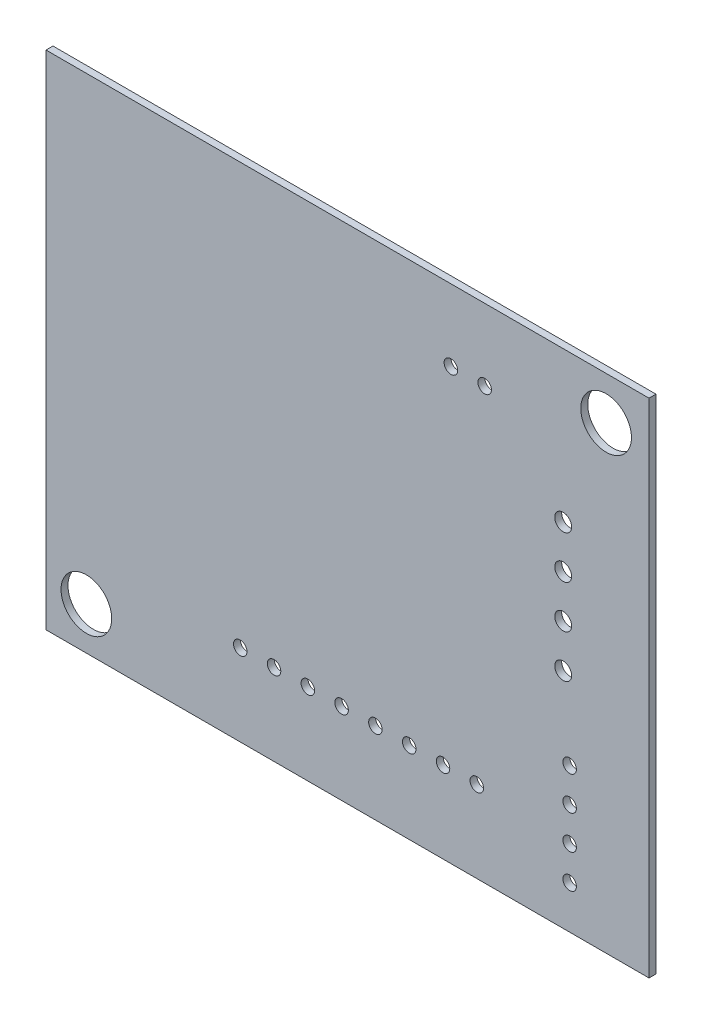
ISO-10303-21;
HEADER;
FILE_DESCRIPTION(('STEP AP214'),'2;1');
FILE_NAME('part.step','',(''),(''),'','','');
FILE_SCHEMA(('AUTOMOTIVE_DESIGN { 1 0 10303 214 1 1 1 1 }'));
ENDSEC;
DATA;
#1=APPLICATION_CONTEXT('core data for automotive mechanical design processes');
#2=APPLICATION_PROTOCOL_DEFINITION('international standard','automotive_design',2000,#1);
#3=PRODUCT_CONTEXT('',#1,'mechanical');
#4=PRODUCT('Part','Part','',(#3));
#5=PRODUCT_RELATED_PRODUCT_CATEGORY('part','',(#4));
#6=PRODUCT_DEFINITION_FORMATION('','',#4);
#7=PRODUCT_DEFINITION_CONTEXT('part definition',#1,'design');
#8=PRODUCT_DEFINITION('design','',#6,#7);
#9=PRODUCT_DEFINITION_SHAPE('','',#8);
#10=(LENGTH_UNIT() NAMED_UNIT(*) SI_UNIT(.MILLI.,.METRE.));
#11=(NAMED_UNIT(*) PLANE_ANGLE_UNIT() SI_UNIT($,.RADIAN.));
#12=(NAMED_UNIT(*) SI_UNIT($,.STERADIAN.) SOLID_ANGLE_UNIT());
#13=UNCERTAINTY_MEASURE_WITH_UNIT(LENGTH_MEASURE(1.E-05),#10,'distance_accuracy_value','');
#14=(GEOMETRIC_REPRESENTATION_CONTEXT(3) GLOBAL_UNCERTAINTY_ASSIGNED_CONTEXT((#13)) GLOBAL_UNIT_ASSIGNED_CONTEXT((#10,
#11,#12)) REPRESENTATION_CONTEXT('',''));
#15=CARTESIAN_POINT('',(0.,0.,0.));
#16=DIRECTION('',(0.,0.,1.));
#17=DIRECTION('',(1.,0.,0.));
#18=AXIS2_PLACEMENT_3D('',#15,#16,#17);
#19=CARTESIAN_POINT('',(67.564002990723,64.388999938965,0.41148));
#20=DIRECTION('',(0.,0.,-1.));
#21=DIRECTION('',(0.,-1.,0.));
#22=AXIS2_PLACEMENT_3D('',#19,#20,#21);
#23=PLANE('',#22);
#24=CARTESIAN_POINT('',(100.711,91.567,0.41148));
#25=DIRECTION('',(0.,0.,1.));
#26=DIRECTION('',(1.,0.,0.));
#27=AXIS2_PLACEMENT_3D('',#24,#25,#26);
#28=CIRCLE('',#27,1.5);
#29=CARTESIAN_POINT('',(102.211,91.567,0.41148));
#30=VERTEX_POINT('',#29);
#31=EDGE_CURVE('E26',#30,#30,#28,.T.);
#32=ORIENTED_EDGE('',*,*,#31,.F.);
#33=EDGE_LOOP('',(#32));
#34=FACE_BOUND('',#33,.T.);
#35=CARTESIAN_POINT('',(98.171,85.217,0.41148));
#36=DIRECTION('',(0.,0.,1.));
#37=DIRECTION('',(1.,0.,0.));
#38=AXIS2_PLACEMENT_3D('',#35,#36,#37);
#39=CIRCLE('',#38,0.5);
#40=CARTESIAN_POINT('',(98.671,85.217,0.41148));
#41=VERTEX_POINT('',#40);
#42=EDGE_CURVE('E298',#41,#41,#39,.T.);
#43=ORIENTED_EDGE('',*,*,#42,.F.);
#44=EDGE_LOOP('',(#43));
#45=FACE_BOUND('',#44,.T.);
#46=CARTESIAN_POINT('',(98.171,80.137,0.41148));
#47=DIRECTION('',(0.,0.,1.));
#48=DIRECTION('',(1.,0.,0.));
#49=AXIS2_PLACEMENT_3D('',#46,#47,#48);
#50=CIRCLE('',#49,0.5);
#51=CARTESIAN_POINT('',(98.671,80.137,0.41148));
#52=VERTEX_POINT('',#51);
#53=EDGE_CURVE('E320',#52,#52,#50,.T.);
#54=ORIENTED_EDGE('',*,*,#53,.F.);
#55=EDGE_LOOP('',(#54));
#56=FACE_BOUND('',#55,.T.);
#57=CARTESIAN_POINT('',(93.524,89.864,0.41148));
#58=DIRECTION('',(0.,0.,1.));
#59=DIRECTION('',(1.,0.,0.));
#60=AXIS2_PLACEMENT_3D('',#57,#58,#59);
#61=CIRCLE('',#60,0.4);
#62=CARTESIAN_POINT('',(93.924,89.864,0.41148));
#63=VERTEX_POINT('',#62);
#64=EDGE_CURVE('E219',#63,#63,#61,.T.);
#65=ORIENTED_EDGE('',*,*,#64,.F.);
#66=EDGE_LOOP('',(#65));
#67=FACE_BOUND('',#66,.T.);
#68=CARTESIAN_POINT('',(98.171,82.677,0.41148));
#69=DIRECTION('',(0.,0.,1.));
#70=DIRECTION('',(1.,0.,0.));
#71=AXIS2_PLACEMENT_3D('',#68,#69,#70);
#72=CIRCLE('',#71,0.5);
#73=CARTESIAN_POINT('',(98.671,82.677,0.41148));
#74=VERTEX_POINT('',#73);
#75=EDGE_CURVE('E277',#74,#74,#72,.T.);
#76=ORIENTED_EDGE('',*,*,#75,.F.);
#77=EDGE_LOOP('',(#76));
#78=FACE_BOUND('',#77,.T.);
#79=CARTESIAN_POINT('',(98.552,68.922,0.41148));
#80=DIRECTION('',(0.,0.,1.));
#81=DIRECTION('',(1.,0.,0.));
#82=AXIS2_PLACEMENT_3D('',#79,#80,#81);
#83=CIRCLE('',#82,0.4);
#84=CARTESIAN_POINT('',(98.952,68.922,0.41148));
#85=VERTEX_POINT('',#84);
#86=EDGE_CURVE('E329',#85,#85,#83,.T.);
#87=ORIENTED_EDGE('',*,*,#86,.F.);
#88=EDGE_LOOP('',(#87));
#89=FACE_BOUND('',#88,.T.);
#90=CARTESIAN_POINT('',(98.552,70.922,0.41148));
#91=DIRECTION('',(0.,0.,1.));
#92=DIRECTION('',(1.,0.,0.));
#93=AXIS2_PLACEMENT_3D('',#90,#91,#92);
#94=CIRCLE('',#93,0.4);
#95=CARTESIAN_POINT('',(98.952,70.922,0.41148));
#96=VERTEX_POINT('',#95);
#97=EDGE_CURVE('E292',#96,#96,#94,.T.);
#98=ORIENTED_EDGE('',*,*,#97,.F.);
#99=EDGE_LOOP('',(#98));
#100=FACE_BOUND('',#99,.T.);
#101=CARTESIAN_POINT('',(98.552,66.922,0.41148));
#102=DIRECTION('',(0.,0.,1.));
#103=DIRECTION('',(1.,0.,0.));
#104=AXIS2_PLACEMENT_3D('',#101,#102,#103);
#105=CIRCLE('',#104,0.4);
#106=CARTESIAN_POINT('',(98.952,66.922,0.41148));
#107=VERTEX_POINT('',#106);
#108=EDGE_CURVE('E259',#107,#107,#105,.T.);
#109=ORIENTED_EDGE('',*,*,#108,.F.);
#110=EDGE_LOOP('',(#109));
#111=FACE_BOUND('',#110,.T.);
#112=CARTESIAN_POINT('',(98.171,77.597,0.41148));
#113=DIRECTION('',(0.,0.,1.));
#114=DIRECTION('',(1.,0.,0.));
#115=AXIS2_PLACEMENT_3D('',#112,#113,#114);
#116=CIRCLE('',#115,0.5);
#117=CARTESIAN_POINT('',(98.671,77.597,0.41148));
#118=VERTEX_POINT('',#117);
#119=EDGE_CURVE('E251',#118,#118,#116,.T.);
#120=ORIENTED_EDGE('',*,*,#119,.F.);
#121=EDGE_LOOP('',(#120));
#122=FACE_BOUND('',#121,.T.);
#123=CARTESIAN_POINT('',(98.552,72.922,0.41148));
#124=DIRECTION('',(0.,0.,1.));
#125=DIRECTION('',(1.,0.,0.));
#126=AXIS2_PLACEMENT_3D('',#123,#124,#125);
#127=CIRCLE('',#126,0.4);
#128=CARTESIAN_POINT('',(98.952,72.922,0.41148));
#129=VERTEX_POINT('',#128);
#130=EDGE_CURVE('E237',#129,#129,#127,.T.);
#131=ORIENTED_EDGE('',*,*,#130,.F.);
#132=EDGE_LOOP('',(#131));
#133=FACE_BOUND('',#132,.T.);
#134=CARTESIAN_POINT('',(93.058,69.215,0.41148));
#135=DIRECTION('',(0.,0.,1.));
#136=DIRECTION('',(1.,0.,0.));
#137=AXIS2_PLACEMENT_3D('',#134,#135,#136);
#138=CIRCLE('',#137,0.4);
#139=CARTESIAN_POINT('',(93.458,69.215,0.41148));
#140=VERTEX_POINT('',#139);
#141=EDGE_CURVE('E271',#140,#140,#138,.T.);
#142=ORIENTED_EDGE('',*,*,#141,.F.);
#143=EDGE_LOOP('',(#142));
#144=FACE_BOUND('',#143,.T.);
#145=CARTESIAN_POINT('',(91.524,89.864,0.41148));
#146=DIRECTION('',(0.,0.,1.));
#147=DIRECTION('',(1.,0.,0.));
#148=AXIS2_PLACEMENT_3D('',#145,#146,#147);
#149=CIRCLE('',#148,0.4);
#150=CARTESIAN_POINT('',(91.924,89.864,0.41148));
#151=VERTEX_POINT('',#150);
#152=EDGE_CURVE('E368',#151,#151,#149,.T.);
#153=ORIENTED_EDGE('',*,*,#152,.F.);
#154=EDGE_LOOP('',(#153));
#155=FACE_BOUND('',#154,.T.);
#156=CARTESIAN_POINT('',(91.058,69.215,0.41148));
#157=DIRECTION('',(0.,0.,1.));
#158=DIRECTION('',(1.,0.,0.));
#159=AXIS2_PLACEMENT_3D('',#156,#157,#158);
#160=CIRCLE('',#159,0.4);
#161=CARTESIAN_POINT('',(91.458,69.215,0.41148));
#162=VERTEX_POINT('',#161);
#163=EDGE_CURVE('E264',#162,#162,#160,.T.);
#164=ORIENTED_EDGE('',*,*,#163,.F.);
#165=EDGE_LOOP('',(#164));
#166=FACE_BOUND('',#165,.T.);
#167=CARTESIAN_POINT('',(87.058,69.215,0.41148));
#168=DIRECTION('',(0.,0.,1.));
#169=DIRECTION('',(1.,0.,0.));
#170=AXIS2_PLACEMENT_3D('',#167,#168,#169);
#171=CIRCLE('',#170,0.4);
#172=CARTESIAN_POINT('',(87.458,69.215,0.41148));
#173=VERTEX_POINT('',#172);
#174=EDGE_CURVE('E162',#173,#173,#171,.T.);
#175=ORIENTED_EDGE('',*,*,#174,.F.);
#176=EDGE_LOOP('',(#175));
#177=FACE_BOUND('',#176,.T.);
#178=CARTESIAN_POINT('',(89.058,69.215,0.41148));
#179=DIRECTION('',(0.,0.,1.));
#180=DIRECTION('',(1.,0.,0.));
#181=AXIS2_PLACEMENT_3D('',#178,#179,#180);
#182=CIRCLE('',#181,0.4);
#183=CARTESIAN_POINT('',(89.458,69.215,0.41148));
#184=VERTEX_POINT('',#183);
#185=EDGE_CURVE('E282',#184,#184,#182,.T.);
#186=ORIENTED_EDGE('',*,*,#185,.F.);
#187=EDGE_LOOP('',(#186));
#188=FACE_BOUND('',#187,.T.);
#189=CARTESIAN_POINT('',(83.058,69.215,0.41148));
#190=DIRECTION('',(0.,0.,1.));
#191=DIRECTION('',(1.,0.,0.));
#192=AXIS2_PLACEMENT_3D('',#189,#190,#191);
#193=CIRCLE('',#192,0.4);
#194=CARTESIAN_POINT('',(83.458,69.215,0.41148));
#195=VERTEX_POINT('',#194);
#196=EDGE_CURVE('E315',#195,#195,#193,.T.);
#197=ORIENTED_EDGE('',*,*,#196,.F.);
#198=EDGE_LOOP('',(#197));
#199=FACE_BOUND('',#198,.T.);
#200=CARTESIAN_POINT('',(81.058,69.215,0.41148));
#201=DIRECTION('',(0.,0.,1.));
#202=DIRECTION('',(1.,0.,0.));
#203=AXIS2_PLACEMENT_3D('',#200,#201,#202);
#204=CIRCLE('',#203,0.4);
#205=CARTESIAN_POINT('',(81.458,69.215,0.41148));
#206=VERTEX_POINT('',#205);
#207=EDGE_CURVE('E411',#206,#206,#204,.T.);
#208=ORIENTED_EDGE('',*,*,#207,.F.);
#209=EDGE_LOOP('',(#208));
#210=FACE_BOUND('',#209,.T.);
#211=CARTESIAN_POINT('',(85.058,69.215,0.41148));
#212=DIRECTION('',(0.,0.,1.));
#213=DIRECTION('',(1.,0.,0.));
#214=AXIS2_PLACEMENT_3D('',#211,#212,#213);
#215=CIRCLE('',#214,0.4);
#216=CARTESIAN_POINT('',(85.458,69.215,0.41148));
#217=VERTEX_POINT('',#216);
#218=EDGE_CURVE('E357',#217,#217,#215,.T.);
#219=ORIENTED_EDGE('',*,*,#218,.F.);
#220=EDGE_LOOP('',(#219));
#221=FACE_BOUND('',#220,.T.);
#222=CARTESIAN_POINT('',(79.058,69.215,0.41148));
#223=DIRECTION('',(0.,0.,1.));
#224=DIRECTION('',(1.,0.,0.));
#225=AXIS2_PLACEMENT_3D('',#222,#223,#224);
#226=CIRCLE('',#225,0.4);
#227=CARTESIAN_POINT('',(79.458,69.215,0.41148));
#228=VERTEX_POINT('',#227);
#229=EDGE_CURVE('E373',#228,#228,#226,.T.);
#230=ORIENTED_EDGE('',*,*,#229,.F.);
#231=EDGE_LOOP('',(#230));
#232=FACE_BOUND('',#231,.T.);
#233=CARTESIAN_POINT('',(69.952,66.904,0.41148));
#234=DIRECTION('',(0.,0.,1.));
#235=DIRECTION('',(1.,0.,0.));
#236=AXIS2_PLACEMENT_3D('',#233,#234,#235);
#237=CIRCLE('',#236,1.5);
#238=CARTESIAN_POINT('',(71.452,66.904,0.41148));
#239=VERTEX_POINT('',#238);
#240=EDGE_CURVE('E388',#239,#239,#237,.T.);
#241=ORIENTED_EDGE('',*,*,#240,.F.);
#242=EDGE_LOOP('',(#241));
#243=FACE_BOUND('',#242,.T.);
#244=DIRECTION('',(1.,0.,0.));
#245=VECTOR('',#244,1.);
#246=CARTESIAN_POINT('',(67.564002990723,64.388999938965,0.41148));
#247=LINE('',#246,#245);
#248=CARTESIAN_POINT('',(67.564002990723,64.388999938965,0.41148));
#249=VERTEX_POINT('',#248);
#250=CARTESIAN_POINT('',(103.25099945068,64.388999938965,0.41148));
#251=VERTEX_POINT('',#250);
#252=EDGE_CURVE('E305',#249,#251,#247,.T.);
#253=ORIENTED_EDGE('',*,*,#252,.T.);
#254=DIRECTION('',(0.,1.,0.));
#255=VECTOR('',#254,1.);
#256=CARTESIAN_POINT('',(103.25099945068,64.388999938965,0.41148));
#257=LINE('',#256,#255);
#258=CARTESIAN_POINT('',(103.25099945068,94.107002258301,0.41148));
#259=VERTEX_POINT('',#258);
#260=EDGE_CURVE('E336',#251,#259,#257,.T.);
#261=ORIENTED_EDGE('',*,*,#260,.T.);
#262=DIRECTION('',(-1.,0.,0.));
#263=VECTOR('',#262,1.);
#264=CARTESIAN_POINT('',(103.25099945068,94.107002258301,0.41148));
#265=LINE('',#264,#263);
#266=CARTESIAN_POINT('',(67.564002990723,94.107002258301,0.41148));
#267=VERTEX_POINT('',#266);
#268=EDGE_CURVE('E19',#259,#267,#265,.T.);
#269=ORIENTED_EDGE('',*,*,#268,.T.);
#270=DIRECTION('',(0.,-1.,0.));
#271=VECTOR('',#270,1.);
#272=CARTESIAN_POINT('',(67.564002990723,94.107002258301,0.41148));
#273=LINE('',#272,#271);
#274=EDGE_CURVE('E389',#267,#249,#273,.T.);
#275=ORIENTED_EDGE('',*,*,#274,.T.);
#276=EDGE_LOOP('',(#253,#261,#269,#275));
#277=FACE_BOUND('',#276,.T.);
#278=ADVANCED_FACE('F15',(#34,#45,#56,#67,#78,#89,#100,#111,#122,#133,#144,#155,#166,#177,#188,
#199,#210,#221,#232,#243,#277),#23,.F.);
#279=CARTESIAN_POINT('',(67.564002990723,64.388999938965,0.));
#280=DIRECTION('',(0.,0.,-1.));
#281=DIRECTION('',(0.,-1.,0.));
#282=AXIS2_PLACEMENT_3D('',#279,#280,#281);
#283=PLANE('',#282);
#284=CARTESIAN_POINT('',(100.711,91.567,0.));
#285=DIRECTION('',(0.,0.,1.));
#286=DIRECTION('',(1.,0.,0.));
#287=AXIS2_PLACEMENT_3D('',#284,#285,#286);
#288=CIRCLE('',#287,1.5);
#289=CARTESIAN_POINT('',(102.211,91.567,0.));
#290=VERTEX_POINT('',#289);
#291=EDGE_CURVE('E10',#290,#290,#288,.T.);
#292=ORIENTED_EDGE('',*,*,#291,.T.);
#293=EDGE_LOOP('',(#292));
#294=FACE_BOUND('',#293,.T.);
#295=CARTESIAN_POINT('',(98.171,85.217,0.));
#296=DIRECTION('',(0.,0.,1.));
#297=DIRECTION('',(1.,0.,0.));
#298=AXIS2_PLACEMENT_3D('',#295,#296,#297);
#299=CIRCLE('',#298,0.5);
#300=CARTESIAN_POINT('',(98.671,85.217,0.));
#301=VERTEX_POINT('',#300);
#302=EDGE_CURVE('E306',#301,#301,#299,.T.);
#303=ORIENTED_EDGE('',*,*,#302,.T.);
#304=EDGE_LOOP('',(#303));
#305=FACE_BOUND('',#304,.T.);
#306=CARTESIAN_POINT('',(98.171,80.137,0.));
#307=DIRECTION('',(0.,0.,1.));
#308=DIRECTION('',(1.,0.,0.));
#309=AXIS2_PLACEMENT_3D('',#306,#307,#308);
#310=CIRCLE('',#309,0.5);
#311=CARTESIAN_POINT('',(98.671,80.137,0.));
#312=VERTEX_POINT('',#311);
#313=EDGE_CURVE('E299',#312,#312,#310,.T.);
#314=ORIENTED_EDGE('',*,*,#313,.T.);
#315=EDGE_LOOP('',(#314));
#316=FACE_BOUND('',#315,.T.);
#317=CARTESIAN_POINT('',(93.524,89.864,0.));
#318=DIRECTION('',(0.,0.,1.));
#319=DIRECTION('',(1.,0.,0.));
#320=AXIS2_PLACEMENT_3D('',#317,#318,#319);
#321=CIRCLE('',#320,0.4);
#322=CARTESIAN_POINT('',(93.924,89.864,0.));
#323=VERTEX_POINT('',#322);
#324=EDGE_CURVE('E227',#323,#323,#321,.T.);
#325=ORIENTED_EDGE('',*,*,#324,.T.);
#326=EDGE_LOOP('',(#325));
#327=FACE_BOUND('',#326,.T.);
#328=CARTESIAN_POINT('',(98.171,82.677,0.));
#329=DIRECTION('',(0.,0.,1.));
#330=DIRECTION('',(1.,0.,0.));
#331=AXIS2_PLACEMENT_3D('',#328,#329,#330);
#332=CIRCLE('',#331,0.5);
#333=CARTESIAN_POINT('',(98.671,82.677,0.));
#334=VERTEX_POINT('',#333);
#335=EDGE_CURVE('E273',#334,#334,#332,.T.);
#336=ORIENTED_EDGE('',*,*,#335,.T.);
#337=EDGE_LOOP('',(#336));
#338=FACE_BOUND('',#337,.T.);
#339=CARTESIAN_POINT('',(98.552,68.922,0.));
#340=DIRECTION('',(0.,0.,1.));
#341=DIRECTION('',(1.,0.,0.));
#342=AXIS2_PLACEMENT_3D('',#339,#340,#341);
#343=CIRCLE('',#342,0.4);
#344=CARTESIAN_POINT('',(98.952,68.922,0.));
#345=VERTEX_POINT('',#344);
#346=EDGE_CURVE('E359',#345,#345,#343,.T.);
#347=ORIENTED_EDGE('',*,*,#346,.T.);
#348=EDGE_LOOP('',(#347));
#349=FACE_BOUND('',#348,.T.);
#350=CARTESIAN_POINT('',(98.552,70.922,0.));
#351=DIRECTION('',(0.,0.,1.));
#352=DIRECTION('',(1.,0.,0.));
#353=AXIS2_PLACEMENT_3D('',#350,#351,#352);
#354=CIRCLE('',#353,0.4);
#355=CARTESIAN_POINT('',(98.952,70.922,0.));
#356=VERTEX_POINT('',#355);
#357=EDGE_CURVE('E330',#356,#356,#354,.T.);
#358=ORIENTED_EDGE('',*,*,#357,.T.);
#359=EDGE_LOOP('',(#358));
#360=FACE_BOUND('',#359,.T.);
#361=CARTESIAN_POINT('',(98.552,66.922,0.));
#362=DIRECTION('',(0.,0.,1.));
#363=DIRECTION('',(1.,0.,0.));
#364=AXIS2_PLACEMENT_3D('',#361,#362,#363);
#365=CIRCLE('',#364,0.4);
#366=CARTESIAN_POINT('',(98.952,66.922,0.));
#367=VERTEX_POINT('',#366);
#368=EDGE_CURVE('E293',#367,#367,#365,.T.);
#369=ORIENTED_EDGE('',*,*,#368,.T.);
#370=EDGE_LOOP('',(#369));
#371=FACE_BOUND('',#370,.T.);
#372=CARTESIAN_POINT('',(98.171,77.597,0.));
#373=DIRECTION('',(0.,0.,1.));
#374=DIRECTION('',(1.,0.,0.));
#375=AXIS2_PLACEMENT_3D('',#372,#373,#374);
#376=CIRCLE('',#375,0.5);
#377=CARTESIAN_POINT('',(98.671,77.597,0.));
#378=VERTEX_POINT('',#377);
#379=EDGE_CURVE('E243',#378,#378,#376,.T.);
#380=ORIENTED_EDGE('',*,*,#379,.T.);
#381=EDGE_LOOP('',(#380));
#382=FACE_BOUND('',#381,.T.);
#383=CARTESIAN_POINT('',(98.552,72.922,0.));
#384=DIRECTION('',(0.,0.,1.));
#385=DIRECTION('',(1.,0.,0.));
#386=AXIS2_PLACEMENT_3D('',#383,#384,#385);
#387=CIRCLE('',#386,0.4);
#388=CARTESIAN_POINT('',(98.952,72.922,0.));
#389=VERTEX_POINT('',#388);
#390=EDGE_CURVE('E317',#389,#389,#387,.T.);
#391=ORIENTED_EDGE('',*,*,#390,.T.);
#392=EDGE_LOOP('',(#391));
#393=FACE_BOUND('',#392,.T.);
#394=CARTESIAN_POINT('',(93.058,69.215,0.));
#395=DIRECTION('',(0.,0.,1.));
#396=DIRECTION('',(1.,0.,0.));
#397=AXIS2_PLACEMENT_3D('',#394,#395,#396);
#398=CIRCLE('',#397,0.4);
#399=CARTESIAN_POINT('',(93.458,69.215,0.));
#400=VERTEX_POINT('',#399);
#401=EDGE_CURVE('E346',#400,#400,#398,.T.);
#402=ORIENTED_EDGE('',*,*,#401,.T.);
#403=EDGE_LOOP('',(#402));
#404=FACE_BOUND('',#403,.T.);
#405=CARTESIAN_POINT('',(91.524,89.864,0.));
#406=DIRECTION('',(0.,0.,1.));
#407=DIRECTION('',(1.,0.,0.));
#408=AXIS2_PLACEMENT_3D('',#405,#406,#407);
#409=CIRCLE('',#408,0.4);
#410=CARTESIAN_POINT('',(91.924,89.864,0.));
#411=VERTEX_POINT('',#410);
#412=EDGE_CURVE('E272',#411,#411,#409,.T.);
#413=ORIENTED_EDGE('',*,*,#412,.T.);
#414=EDGE_LOOP('',(#413));
#415=FACE_BOUND('',#414,.T.);
#416=CARTESIAN_POINT('',(91.058,69.215,0.));
#417=DIRECTION('',(0.,0.,1.));
#418=DIRECTION('',(1.,0.,0.));
#419=AXIS2_PLACEMENT_3D('',#416,#417,#418);
#420=CIRCLE('',#419,0.4);
#421=CARTESIAN_POINT('',(91.458,69.215,0.));
#422=VERTEX_POINT('',#421);
#423=EDGE_CURVE('E432',#422,#422,#420,.T.);
#424=ORIENTED_EDGE('',*,*,#423,.T.);
#425=EDGE_LOOP('',(#424));
#426=FACE_BOUND('',#425,.T.);
#427=CARTESIAN_POINT('',(87.058,69.215,0.));
#428=DIRECTION('',(0.,0.,1.));
#429=DIRECTION('',(1.,0.,0.));
#430=AXIS2_PLACEMENT_3D('',#427,#428,#429);
#431=CIRCLE('',#430,0.4);
#432=CARTESIAN_POINT('',(87.458,69.215,0.));
#433=VERTEX_POINT('',#432);
#434=EDGE_CURVE('E151',#433,#433,#431,.T.);
#435=ORIENTED_EDGE('',*,*,#434,.T.);
#436=EDGE_LOOP('',(#435));
#437=FACE_BOUND('',#436,.T.);
#438=CARTESIAN_POINT('',(89.058,69.215,0.));
#439=DIRECTION('',(0.,0.,1.));
#440=DIRECTION('',(1.,0.,0.));
#441=AXIS2_PLACEMENT_3D('',#438,#439,#440);
#442=CIRCLE('',#441,0.4);
#443=CARTESIAN_POINT('',(89.458,69.215,0.));
#444=VERTEX_POINT('',#443);
#445=EDGE_CURVE('E287',#444,#444,#442,.T.);
#446=ORIENTED_EDGE('',*,*,#445,.T.);
#447=EDGE_LOOP('',(#446));
#448=FACE_BOUND('',#447,.T.);
#449=CARTESIAN_POINT('',(83.058,69.215,0.));
#450=DIRECTION('',(0.,0.,1.));
#451=DIRECTION('',(1.,0.,0.));
#452=AXIS2_PLACEMENT_3D('',#449,#450,#451);
#453=CIRCLE('',#452,0.4);
#454=CARTESIAN_POINT('',(83.458,69.215,0.));
#455=VERTEX_POINT('',#454);
#456=EDGE_CURVE('E283',#455,#455,#453,.T.);
#457=ORIENTED_EDGE('',*,*,#456,.T.);
#458=EDGE_LOOP('',(#457));
#459=FACE_BOUND('',#458,.T.);
#460=CARTESIAN_POINT('',(81.058,69.215,0.));
#461=DIRECTION('',(0.,0.,1.));
#462=DIRECTION('',(1.,0.,0.));
#463=AXIS2_PLACEMENT_3D('',#460,#461,#462);
#464=CIRCLE('',#463,0.4);
#465=CARTESIAN_POINT('',(81.458,69.215,0.));
#466=VERTEX_POINT('',#465);
#467=EDGE_CURVE('E316',#466,#466,#464,.T.);
#468=ORIENTED_EDGE('',*,*,#467,.T.);
#469=EDGE_LOOP('',(#468));
#470=FACE_BOUND('',#469,.T.);
#471=CARTESIAN_POINT('',(85.058,69.215,0.));
#472=DIRECTION('',(0.,0.,1.));
#473=DIRECTION('',(1.,0.,0.));
#474=AXIS2_PLACEMENT_3D('',#471,#472,#473);
#475=CIRCLE('',#474,0.4);
#476=CARTESIAN_POINT('',(85.458,69.215,0.));
#477=VERTEX_POINT('',#476);
#478=EDGE_CURVE('E353',#477,#477,#475,.T.);
#479=ORIENTED_EDGE('',*,*,#478,.T.);
#480=EDGE_LOOP('',(#479));
#481=FACE_BOUND('',#480,.T.);
#482=CARTESIAN_POINT('',(79.058,69.215,0.));
#483=DIRECTION('',(0.,0.,1.));
#484=DIRECTION('',(1.,0.,0.));
#485=AXIS2_PLACEMENT_3D('',#482,#483,#484);
#486=CIRCLE('',#485,0.4);
#487=CARTESIAN_POINT('',(79.458,69.215,0.));
#488=VERTEX_POINT('',#487);
#489=EDGE_CURVE('E392',#488,#488,#486,.T.);
#490=ORIENTED_EDGE('',*,*,#489,.T.);
#491=EDGE_LOOP('',(#490));
#492=FACE_BOUND('',#491,.T.);
#493=CARTESIAN_POINT('',(69.952,66.904,0.));
#494=DIRECTION('',(0.,0.,1.));
#495=DIRECTION('',(1.,0.,0.));
#496=AXIS2_PLACEMENT_3D('',#493,#494,#495);
#497=CIRCLE('',#496,1.5);
#498=CARTESIAN_POINT('',(71.452,66.904,0.));
#499=VERTEX_POINT('',#498);
#500=EDGE_CURVE('E374',#499,#499,#497,.T.);
#501=ORIENTED_EDGE('',*,*,#500,.T.);
#502=EDGE_LOOP('',(#501));
#503=FACE_BOUND('',#502,.T.);
#504=DIRECTION('',(0.,-1.,0.));
#505=VECTOR('',#504,1.);
#506=CARTESIAN_POINT('',(67.564002990723,94.107002258301,0.));
#507=LINE('',#506,#505);
#508=CARTESIAN_POINT('',(67.564002990723,94.107002258301,0.));
#509=VERTEX_POINT('',#508);
#510=CARTESIAN_POINT('',(67.564002990723,64.388999938965,0.));
#511=VERTEX_POINT('',#510);
#512=EDGE_CURVE('E405',#509,#511,#507,.T.);
#513=ORIENTED_EDGE('',*,*,#512,.F.);
#514=DIRECTION('',(-1.,0.,0.));
#515=VECTOR('',#514,1.);
#516=CARTESIAN_POINT('',(103.25099945068,94.107002258301,0.));
#517=LINE('',#516,#515);
#518=CARTESIAN_POINT('',(103.25099945068,94.107002258301,0.));
#519=VERTEX_POINT('',#518);
#520=EDGE_CURVE('E340',#519,#509,#517,.T.);
#521=ORIENTED_EDGE('',*,*,#520,.F.);
#522=DIRECTION('',(0.,1.,0.));
#523=VECTOR('',#522,1.);
#524=CARTESIAN_POINT('',(103.25099945068,64.388999938965,0.));
#525=LINE('',#524,#523);
#526=CARTESIAN_POINT('',(103.25099945068,64.388999938965,0.));
#527=VERTEX_POINT('',#526);
#528=EDGE_CURVE('E304',#527,#519,#525,.T.);
#529=ORIENTED_EDGE('',*,*,#528,.F.);
#530=DIRECTION('',(1.,0.,0.));
#531=VECTOR('',#530,1.);
#532=CARTESIAN_POINT('',(67.564002990723,64.388999938965,0.));
#533=LINE('',#532,#531);
#534=EDGE_CURVE('E335',#511,#527,#533,.T.);
#535=ORIENTED_EDGE('',*,*,#534,.F.);
#536=EDGE_LOOP('',(#513,#521,#529,#535));
#537=FACE_BOUND('',#536,.T.);
#538=ADVANCED_FACE('F244',(#294,#305,#316,#327,#338,#349,#360,#371,#382,#393,#404,#415,#426,
#437,#448,#459,#470,#481,#492,#503,#537),#283,.T.);
#539=CARTESIAN_POINT('',(100.711,91.567,0.));
#540=DIRECTION('',(0.,0.,-1.));
#541=DIRECTION('',(1.,0.,0.));
#542=AXIS2_PLACEMENT_3D('',#539,#540,#541);
#543=CYLINDRICAL_SURFACE('',#542,1.5);
#544=DIRECTION('',(0.,0.,1.));
#545=VECTOR('',#544,1.);
#546=CARTESIAN_POINT('',(102.211,91.567,0.));
#547=LINE('',#546,#545);
#548=EDGE_CURVE('E310',#290,#30,#547,.T.);
#549=ORIENTED_EDGE('',*,*,#548,.T.);
#550=ORIENTED_EDGE('',*,*,#31,.T.);
#551=ORIENTED_EDGE('',*,*,#548,.F.);
#552=ORIENTED_EDGE('',*,*,#291,.F.);
#553=EDGE_LOOP('',(#549,#550,#551,#552));
#554=FACE_BOUND('',#553,.T.);
#555=ADVANCED_FACE('F529',(#554),#543,.F.);
#556=CARTESIAN_POINT('',(98.171,85.217,0.));
#557=DIRECTION('',(0.,0.,-1.));
#558=DIRECTION('',(1.,0.,0.));
#559=AXIS2_PLACEMENT_3D('',#556,#557,#558);
#560=CYLINDRICAL_SURFACE('',#559,0.5);
#561=DIRECTION('',(0.,0.,1.));
#562=VECTOR('',#561,1.);
#563=CARTESIAN_POINT('',(98.671,85.217,0.));
#564=LINE('',#563,#562);
#565=EDGE_CURVE('E294',#301,#41,#564,.T.);
#566=ORIENTED_EDGE('',*,*,#565,.T.);
#567=ORIENTED_EDGE('',*,*,#42,.T.);
#568=ORIENTED_EDGE('',*,*,#565,.F.);
#569=ORIENTED_EDGE('',*,*,#302,.F.);
#570=EDGE_LOOP('',(#566,#567,#568,#569));
#571=FACE_BOUND('',#570,.T.);
#572=ADVANCED_FACE('F549',(#571),#560,.F.);
#573=CARTESIAN_POINT('',(98.171,80.137,0.));
#574=DIRECTION('',(0.,0.,-1.));
#575=DIRECTION('',(1.,0.,0.));
#576=AXIS2_PLACEMENT_3D('',#573,#574,#575);
#577=CYLINDRICAL_SURFACE('',#576,0.5);
#578=DIRECTION('',(0.,0.,1.));
#579=VECTOR('',#578,1.);
#580=CARTESIAN_POINT('',(98.671,80.137,0.));
#581=LINE('',#580,#579);
#582=EDGE_CURVE('E324',#312,#52,#581,.T.);
#583=ORIENTED_EDGE('',*,*,#582,.T.);
#584=ORIENTED_EDGE('',*,*,#53,.T.);
#585=ORIENTED_EDGE('',*,*,#582,.F.);
#586=ORIENTED_EDGE('',*,*,#313,.F.);
#587=EDGE_LOOP('',(#583,#584,#585,#586));
#588=FACE_BOUND('',#587,.T.);
#589=ADVANCED_FACE('F546',(#588),#577,.F.);
#590=CARTESIAN_POINT('',(93.524,89.864,0.));
#591=DIRECTION('',(0.,0.,-1.));
#592=DIRECTION('',(1.,0.,0.));
#593=AXIS2_PLACEMENT_3D('',#590,#591,#592);
#594=CYLINDRICAL_SURFACE('',#593,0.4);
#595=DIRECTION('',(0.,0.,1.));
#596=VECTOR('',#595,1.);
#597=CARTESIAN_POINT('',(93.924,89.864,0.));
#598=LINE('',#597,#596);
#599=EDGE_CURVE('E276',#323,#63,#598,.T.);
#600=ORIENTED_EDGE('',*,*,#599,.T.);
#601=ORIENTED_EDGE('',*,*,#64,.T.);
#602=ORIENTED_EDGE('',*,*,#599,.F.);
#603=ORIENTED_EDGE('',*,*,#324,.F.);
#604=EDGE_LOOP('',(#600,#601,#602,#603));
#605=FACE_BOUND('',#604,.T.);
#606=ADVANCED_FACE('F548',(#605),#594,.F.);
#607=CARTESIAN_POINT('',(98.171,82.677,0.));
#608=DIRECTION('',(0.,0.,-1.));
#609=DIRECTION('',(1.,0.,0.));
#610=AXIS2_PLACEMENT_3D('',#607,#608,#609);
#611=CYLINDRICAL_SURFACE('',#610,0.5);
#612=DIRECTION('',(0.,0.,1.));
#613=VECTOR('',#612,1.);
#614=CARTESIAN_POINT('',(98.671,82.677,0.));
#615=LINE('',#614,#613);
#616=EDGE_CURVE('E418',#334,#74,#615,.T.);
#617=ORIENTED_EDGE('',*,*,#616,.T.);
#618=ORIENTED_EDGE('',*,*,#75,.T.);
#619=ORIENTED_EDGE('',*,*,#616,.F.);
#620=ORIENTED_EDGE('',*,*,#335,.F.);
#621=EDGE_LOOP('',(#617,#618,#619,#620));
#622=FACE_BOUND('',#621,.T.);
#623=ADVANCED_FACE('F611',(#622),#611,.F.);
#624=CARTESIAN_POINT('',(98.552,68.922,0.));
#625=DIRECTION('',(0.,0.,-1.));
#626=DIRECTION('',(1.,0.,0.));
#627=AXIS2_PLACEMENT_3D('',#624,#625,#626);
#628=CYLINDRICAL_SURFACE('',#627,0.4);
#629=DIRECTION('',(0.,0.,1.));
#630=VECTOR('',#629,1.);
#631=CARTESIAN_POINT('',(98.952,68.922,0.));
#632=LINE('',#631,#630);
#633=EDGE_CURVE('E325',#345,#85,#632,.T.);
#634=ORIENTED_EDGE('',*,*,#633,.T.);
#635=ORIENTED_EDGE('',*,*,#86,.T.);
#636=ORIENTED_EDGE('',*,*,#633,.F.);
#637=ORIENTED_EDGE('',*,*,#346,.F.);
#638=EDGE_LOOP('',(#634,#635,#636,#637));
#639=FACE_BOUND('',#638,.T.);
#640=ADVANCED_FACE('F608',(#639),#628,.F.);
#641=CARTESIAN_POINT('',(98.552,70.922,0.));
#642=DIRECTION('',(0.,0.,-1.));
#643=DIRECTION('',(1.,0.,0.));
#644=AXIS2_PLACEMENT_3D('',#641,#642,#643);
#645=CYLINDRICAL_SURFACE('',#644,0.4);
#646=DIRECTION('',(0.,0.,1.));
#647=VECTOR('',#646,1.);
#648=CARTESIAN_POINT('',(98.952,70.922,0.));
#649=LINE('',#648,#647);
#650=EDGE_CURVE('E288',#356,#96,#649,.T.);
#651=ORIENTED_EDGE('',*,*,#650,.T.);
#652=ORIENTED_EDGE('',*,*,#97,.T.);
#653=ORIENTED_EDGE('',*,*,#650,.F.);
#654=ORIENTED_EDGE('',*,*,#357,.F.);
#655=EDGE_LOOP('',(#651,#652,#653,#654));
#656=FACE_BOUND('',#655,.T.);
#657=ADVANCED_FACE('F610',(#656),#645,.F.);
#658=CARTESIAN_POINT('',(98.552,66.922,0.));
#659=DIRECTION('',(0.,0.,-1.));
#660=DIRECTION('',(1.,0.,0.));
#661=AXIS2_PLACEMENT_3D('',#658,#659,#660);
#662=CYLINDRICAL_SURFACE('',#661,0.4);
#663=DIRECTION('',(0.,0.,1.));
#664=VECTOR('',#663,1.);
#665=CARTESIAN_POINT('',(98.952,66.922,0.));
#666=LINE('',#665,#664);
#667=EDGE_CURVE('E250',#367,#107,#666,.T.);
#668=ORIENTED_EDGE('',*,*,#667,.T.);
#669=ORIENTED_EDGE('',*,*,#108,.T.);
#670=ORIENTED_EDGE('',*,*,#667,.F.);
#671=ORIENTED_EDGE('',*,*,#368,.F.);
#672=EDGE_LOOP('',(#668,#669,#670,#671));
#673=FACE_BOUND('',#672,.T.);
#674=ADVANCED_FACE('F617',(#673),#662,.F.);
#675=CARTESIAN_POINT('',(98.171,77.597,0.));
#676=DIRECTION('',(0.,0.,-1.));
#677=DIRECTION('',(1.,0.,0.));
#678=AXIS2_PLACEMENT_3D('',#675,#676,#677);
#679=CYLINDRICAL_SURFACE('',#678,0.5);
#680=DIRECTION('',(0.,0.,1.));
#681=VECTOR('',#680,1.);
#682=CARTESIAN_POINT('',(98.671,77.597,0.));
#683=LINE('',#682,#681);
#684=EDGE_CURVE('E261',#378,#118,#683,.T.);
#685=ORIENTED_EDGE('',*,*,#684,.T.);
#686=ORIENTED_EDGE('',*,*,#119,.T.);
#687=ORIENTED_EDGE('',*,*,#684,.F.);
#688=ORIENTED_EDGE('',*,*,#379,.F.);
#689=EDGE_LOOP('',(#685,#686,#687,#688));
#690=FACE_BOUND('',#689,.T.);
#691=ADVANCED_FACE('F614',(#690),#679,.F.);
#692=CARTESIAN_POINT('',(98.552,72.922,0.));
#693=DIRECTION('',(0.,0.,-1.));
#694=DIRECTION('',(1.,0.,0.));
#695=AXIS2_PLACEMENT_3D('',#692,#693,#694);
#696=CYLINDRICAL_SURFACE('',#695,0.4);
#697=DIRECTION('',(0.,0.,1.));
#698=VECTOR('',#697,1.);
#699=CARTESIAN_POINT('',(98.952,72.922,0.));
#700=LINE('',#699,#698);
#701=EDGE_CURVE('E352',#389,#129,#700,.T.);
#702=ORIENTED_EDGE('',*,*,#701,.T.);
#703=ORIENTED_EDGE('',*,*,#130,.T.);
#704=ORIENTED_EDGE('',*,*,#701,.F.);
#705=ORIENTED_EDGE('',*,*,#390,.F.);
#706=EDGE_LOOP('',(#702,#703,#704,#705));
#707=FACE_BOUND('',#706,.T.);
#708=ADVANCED_FACE('F616',(#707),#696,.F.);
#709=CARTESIAN_POINT('',(93.058,69.215,0.));
#710=DIRECTION('',(0.,0.,-1.));
#711=DIRECTION('',(1.,0.,0.));
#712=AXIS2_PLACEMENT_3D('',#709,#710,#711);
#713=CYLINDRICAL_SURFACE('',#712,0.4);
#714=DIRECTION('',(0.,0.,1.));
#715=VECTOR('',#714,1.);
#716=CARTESIAN_POINT('',(93.458,69.215,0.));
#717=LINE('',#716,#715);
#718=EDGE_CURVE('E267',#400,#140,#717,.T.);
#719=ORIENTED_EDGE('',*,*,#718,.T.);
#720=ORIENTED_EDGE('',*,*,#141,.T.);
#721=ORIENTED_EDGE('',*,*,#718,.F.);
#722=ORIENTED_EDGE('',*,*,#401,.F.);
#723=EDGE_LOOP('',(#719,#720,#721,#722));
#724=FACE_BOUND('',#723,.T.);
#725=ADVANCED_FACE('F17',(#724),#713,.F.);
#726=CARTESIAN_POINT('',(91.524,89.864,0.));
#727=DIRECTION('',(0.,0.,-1.));
#728=DIRECTION('',(1.,0.,0.));
#729=AXIS2_PLACEMENT_3D('',#726,#727,#728);
#730=CYLINDRICAL_SURFACE('',#729,0.4);
#731=DIRECTION('',(0.,0.,1.));
#732=VECTOR('',#731,1.);
#733=CARTESIAN_POINT('',(91.924,89.864,0.));
#734=LINE('',#733,#732);
#735=EDGE_CURVE('E428',#411,#151,#734,.T.);
#736=ORIENTED_EDGE('',*,*,#735,.T.);
#737=ORIENTED_EDGE('',*,*,#152,.T.);
#738=ORIENTED_EDGE('',*,*,#735,.F.);
#739=ORIENTED_EDGE('',*,*,#412,.F.);
#740=EDGE_LOOP('',(#736,#737,#738,#739));
#741=FACE_BOUND('',#740,.T.);
#742=ADVANCED_FACE('F643',(#741),#730,.F.);
#743=CARTESIAN_POINT('',(91.058,69.215,0.));
#744=DIRECTION('',(0.,0.,-1.));
#745=DIRECTION('',(1.,0.,0.));
#746=AXIS2_PLACEMENT_3D('',#743,#744,#745);
#747=CYLINDRICAL_SURFACE('',#746,0.4);
#748=DIRECTION('',(0.,0.,1.));
#749=VECTOR('',#748,1.);
#750=CARTESIAN_POINT('',(91.458,69.215,0.));
#751=LINE('',#750,#749);
#752=EDGE_CURVE('E447',#422,#162,#751,.T.);
#753=ORIENTED_EDGE('',*,*,#752,.T.);
#754=ORIENTED_EDGE('',*,*,#163,.T.);
#755=ORIENTED_EDGE('',*,*,#752,.F.);
#756=ORIENTED_EDGE('',*,*,#423,.F.);
#757=EDGE_LOOP('',(#753,#754,#755,#756));
#758=FACE_BOUND('',#757,.T.);
#759=ADVANCED_FACE('F637',(#758),#747,.F.);
#760=CARTESIAN_POINT('',(87.058,69.215,0.));
#761=DIRECTION('',(0.,0.,-1.));
#762=DIRECTION('',(1.,0.,0.));
#763=AXIS2_PLACEMENT_3D('',#760,#761,#762);
#764=CYLINDRICAL_SURFACE('',#763,0.4);
#765=DIRECTION('',(0.,0.,1.));
#766=VECTOR('',#765,1.);
#767=CARTESIAN_POINT('',(87.458,69.215,0.));
#768=LINE('',#767,#766);
#769=EDGE_CURVE('E284',#433,#173,#768,.T.);
#770=ORIENTED_EDGE('',*,*,#769,.T.);
#771=ORIENTED_EDGE('',*,*,#174,.T.);
#772=ORIENTED_EDGE('',*,*,#769,.F.);
#773=ORIENTED_EDGE('',*,*,#434,.F.);
#774=EDGE_LOOP('',(#770,#771,#772,#773));
#775=FACE_BOUND('',#774,.T.);
#776=ADVANCED_FACE('F544',(#775),#764,.F.);
#777=CARTESIAN_POINT('',(89.058,69.215,0.));
#778=DIRECTION('',(0.,0.,-1.));
#779=DIRECTION('',(1.,0.,0.));
#780=AXIS2_PLACEMENT_3D('',#777,#778,#779);
#781=CYLINDRICAL_SURFACE('',#780,0.4);
#782=DIRECTION('',(0.,0.,1.));
#783=VECTOR('',#782,1.);
#784=CARTESIAN_POINT('',(89.458,69.215,0.));
#785=LINE('',#784,#783);
#786=EDGE_CURVE('E278',#444,#184,#785,.T.);
#787=ORIENTED_EDGE('',*,*,#786,.T.);
#788=ORIENTED_EDGE('',*,*,#185,.T.);
#789=ORIENTED_EDGE('',*,*,#786,.F.);
#790=ORIENTED_EDGE('',*,*,#445,.F.);
#791=EDGE_LOOP('',(#787,#788,#789,#790));
#792=FACE_BOUND('',#791,.T.);
#793=ADVANCED_FACE('F540',(#792),#781,.F.);
#794=CARTESIAN_POINT('',(83.058,69.215,0.));
#795=DIRECTION('',(0.,0.,-1.));
#796=DIRECTION('',(1.,0.,0.));
#797=AXIS2_PLACEMENT_3D('',#794,#795,#796);
#798=CYLINDRICAL_SURFACE('',#797,0.4);
#799=DIRECTION('',(0.,0.,1.));
#800=VECTOR('',#799,1.);
#801=CARTESIAN_POINT('',(83.458,69.215,0.));
#802=LINE('',#801,#800);
#803=EDGE_CURVE('E311',#455,#195,#802,.T.);
#804=ORIENTED_EDGE('',*,*,#803,.T.);
#805=ORIENTED_EDGE('',*,*,#196,.T.);
#806=ORIENTED_EDGE('',*,*,#803,.F.);
#807=ORIENTED_EDGE('',*,*,#456,.F.);
#808=EDGE_LOOP('',(#804,#805,#806,#807));
#809=FACE_BOUND('',#808,.T.);
#810=ADVANCED_FACE('F543',(#809),#798,.F.);
#811=CARTESIAN_POINT('',(81.058,69.215,0.));
#812=DIRECTION('',(0.,0.,-1.));
#813=DIRECTION('',(1.,0.,0.));
#814=AXIS2_PLACEMENT_3D('',#811,#812,#813);
#815=CYLINDRICAL_SURFACE('',#814,0.4);
#816=DIRECTION('',(0.,0.,1.));
#817=VECTOR('',#816,1.);
#818=CARTESIAN_POINT('',(81.458,69.215,0.));
#819=LINE('',#818,#817);
#820=EDGE_CURVE('E356',#466,#206,#819,.T.);
#821=ORIENTED_EDGE('',*,*,#820,.T.);
#822=ORIENTED_EDGE('',*,*,#207,.T.);
#823=ORIENTED_EDGE('',*,*,#820,.F.);
#824=ORIENTED_EDGE('',*,*,#467,.F.);
#825=EDGE_LOOP('',(#821,#822,#823,#824));
#826=FACE_BOUND('',#825,.T.);
#827=ADVANCED_FACE('F599',(#826),#815,.F.);
#828=CARTESIAN_POINT('',(85.058,69.215,0.));
#829=DIRECTION('',(0.,0.,-1.));
#830=DIRECTION('',(1.,0.,0.));
#831=AXIS2_PLACEMENT_3D('',#828,#829,#830);
#832=CYLINDRICAL_SURFACE('',#831,0.4);
#833=DIRECTION('',(0.,0.,1.));
#834=VECTOR('',#833,1.);
#835=CARTESIAN_POINT('',(85.458,69.215,0.));
#836=LINE('',#835,#834);
#837=EDGE_CURVE('E394',#477,#217,#836,.T.);
#838=ORIENTED_EDGE('',*,*,#837,.T.);
#839=ORIENTED_EDGE('',*,*,#218,.T.);
#840=ORIENTED_EDGE('',*,*,#837,.F.);
#841=ORIENTED_EDGE('',*,*,#478,.F.);
#842=EDGE_LOOP('',(#838,#839,#840,#841));
#843=FACE_BOUND('',#842,.T.);
#844=ADVANCED_FACE('F593',(#843),#832,.F.);
#845=CARTESIAN_POINT('',(79.058,69.215,0.));
#846=DIRECTION('',(0.,0.,-1.));
#847=DIRECTION('',(1.,0.,0.));
#848=AXIS2_PLACEMENT_3D('',#845,#846,#847);
#849=CYLINDRICAL_SURFACE('',#848,0.4);
#850=DIRECTION('',(0.,0.,1.));
#851=VECTOR('',#850,1.);
#852=CARTESIAN_POINT('',(79.458,69.215,0.));
#853=LINE('',#852,#851);
#854=EDGE_CURVE('E369',#488,#228,#853,.T.);
#855=ORIENTED_EDGE('',*,*,#854,.T.);
#856=ORIENTED_EDGE('',*,*,#229,.T.);
#857=ORIENTED_EDGE('',*,*,#854,.F.);
#858=ORIENTED_EDGE('',*,*,#489,.F.);
#859=EDGE_LOOP('',(#855,#856,#857,#858));
#860=FACE_BOUND('',#859,.T.);
#861=ADVANCED_FACE('F538',(#860),#849,.F.);
#862=CARTESIAN_POINT('',(69.952,66.904,0.));
#863=DIRECTION('',(0.,0.,-1.));
#864=DIRECTION('',(1.,0.,0.));
#865=AXIS2_PLACEMENT_3D('',#862,#863,#864);
#866=CYLINDRICAL_SURFACE('',#865,1.5);
#867=DIRECTION('',(0.,0.,1.));
#868=VECTOR('',#867,1.);
#869=CARTESIAN_POINT('',(71.452,66.904,0.));
#870=LINE('',#869,#868);
#871=EDGE_CURVE('E384',#499,#239,#870,.T.);
#872=ORIENTED_EDGE('',*,*,#871,.T.);
#873=ORIENTED_EDGE('',*,*,#240,.T.);
#874=ORIENTED_EDGE('',*,*,#871,.F.);
#875=ORIENTED_EDGE('',*,*,#500,.F.);
#876=EDGE_LOOP('',(#872,#873,#874,#875));
#877=FACE_BOUND('',#876,.T.);
#878=ADVANCED_FACE('F535',(#877),#866,.F.);
#879=CARTESIAN_POINT('',(67.564002990723,94.107002258301,0.));
#880=DIRECTION('',(1.,0.,0.));
#881=DIRECTION('',(0.,1.,0.));
#882=AXIS2_PLACEMENT_3D('',#879,#880,#881);
#883=PLANE('',#882);
#884=ORIENTED_EDGE('',*,*,#512,.T.);
#885=DIRECTION('',(0.,0.,1.));
#886=VECTOR('',#885,1.);
#887=CARTESIAN_POINT('',(67.564002990723,64.388999938965,0.));
#888=LINE('',#887,#886);
#889=EDGE_CURVE('E300',#511,#249,#888,.T.);
#890=ORIENTED_EDGE('',*,*,#889,.T.);
#891=ORIENTED_EDGE('',*,*,#274,.F.);
#892=DIRECTION('',(0.,0.,1.));
#893=VECTOR('',#892,1.);
#894=CARTESIAN_POINT('',(67.564002990723,94.107002258301,0.));
#895=LINE('',#894,#893);
#896=EDGE_CURVE('E399',#509,#267,#895,.T.);
#897=ORIENTED_EDGE('',*,*,#896,.F.);
#898=EDGE_LOOP('',(#884,#890,#891,#897));
#899=FACE_BOUND('',#898,.T.);
#900=ADVANCED_FACE('F499',(#899),#883,.F.);
#901=CARTESIAN_POINT('',(103.25099945068,94.107002258301,0.));
#902=DIRECTION('',(0.,-1.,0.));
#903=DIRECTION('',(0.,0.,-1.));
#904=AXIS2_PLACEMENT_3D('',#901,#902,#903);
#905=PLANE('',#904);
#906=ORIENTED_EDGE('',*,*,#520,.T.);
#907=ORIENTED_EDGE('',*,*,#896,.T.);
#908=ORIENTED_EDGE('',*,*,#268,.F.);
#909=DIRECTION('',(0.,0.,1.));
#910=VECTOR('',#909,1.);
#911=CARTESIAN_POINT('',(103.25099945068,94.107002258301,0.));
#912=LINE('',#911,#910);
#913=EDGE_CURVE('E341',#519,#259,#912,.T.);
#914=ORIENTED_EDGE('',*,*,#913,.F.);
#915=EDGE_LOOP('',(#906,#907,#908,#914));
#916=FACE_BOUND('',#915,.T.);
#917=ADVANCED_FACE('F498',(#916),#905,.F.);
#918=CARTESIAN_POINT('',(103.25099945068,64.388999938965,0.));
#919=DIRECTION('',(-1.,0.,0.));
#920=DIRECTION('',(0.,0.,1.));
#921=AXIS2_PLACEMENT_3D('',#918,#919,#920);
#922=PLANE('',#921);
#923=ORIENTED_EDGE('',*,*,#528,.T.);
#924=ORIENTED_EDGE('',*,*,#913,.T.);
#925=ORIENTED_EDGE('',*,*,#260,.F.);
#926=DIRECTION('',(0.,0.,1.));
#927=VECTOR('',#926,1.);
#928=CARTESIAN_POINT('',(103.25099945068,64.388999938965,0.));
#929=LINE('',#928,#927);
#930=EDGE_CURVE('E331',#527,#251,#929,.T.);
#931=ORIENTED_EDGE('',*,*,#930,.F.);
#932=EDGE_LOOP('',(#923,#924,#925,#931));
#933=FACE_BOUND('',#932,.T.);
#934=ADVANCED_FACE('F509',(#933),#922,.F.);
#935=CARTESIAN_POINT('',(67.564002990723,64.388999938965,0.));
#936=DIRECTION('',(0.,1.,0.));
#937=DIRECTION('',(1.,0.,0.));
#938=AXIS2_PLACEMENT_3D('',#935,#936,#937);
#939=PLANE('',#938);
#940=ORIENTED_EDGE('',*,*,#534,.T.);
#941=ORIENTED_EDGE('',*,*,#930,.T.);
#942=ORIENTED_EDGE('',*,*,#252,.F.);
#943=ORIENTED_EDGE('',*,*,#889,.F.);
#944=EDGE_LOOP('',(#940,#941,#942,#943));
#945=FACE_BOUND('',#944,.T.);
#946=ADVANCED_FACE('F506',(#945),#939,.F.);
#947=CLOSED_SHELL('',(#278,#538,#555,#572,#589,#606,#623,#640,#657,#674,#691,#708,#725,#742,
#759,#776,#793,#810,#827,#844,#861,#878,#900,#917,#934,#946));
#948=MANIFOLD_SOLID_BREP('B1',#947);
#949=ADVANCED_BREP_SHAPE_REPRESENTATION('',(#18,#948),#14);
#950=SHAPE_DEFINITION_REPRESENTATION(#9,#949);
ENDSEC;
END-ISO-10303-21;
